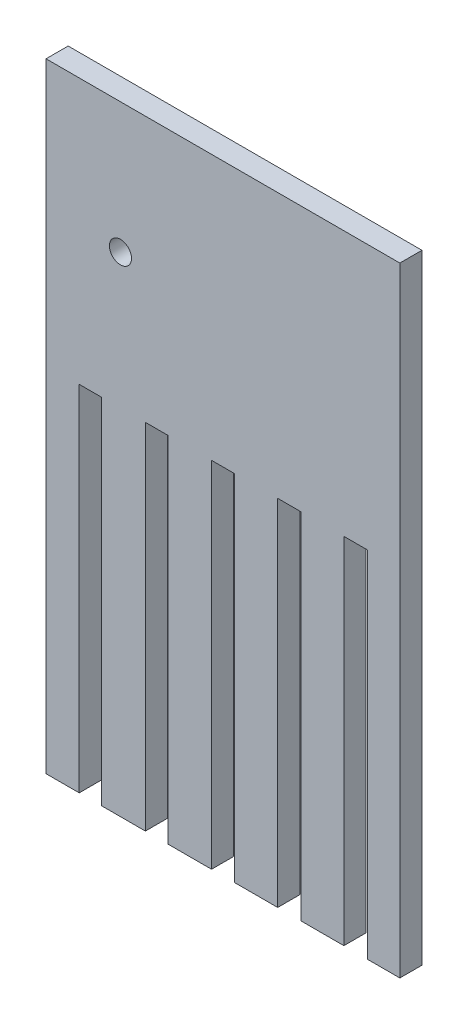
ISO-10303-21;
HEADER;
FILE_DESCRIPTION(('STEP AP214'),'2;1');
FILE_NAME('part.step','',(''),(''),'','','');
FILE_SCHEMA(('AUTOMOTIVE_DESIGN { 1 0 10303 214 1 1 1 1 }'));
ENDSEC;
DATA;
#1=APPLICATION_CONTEXT('core data for automotive mechanical design processes');
#2=APPLICATION_PROTOCOL_DEFINITION('international standard','automotive_design',2000,#1);
#3=PRODUCT_CONTEXT('',#1,'mechanical');
#4=PRODUCT('Part','Part','',(#3));
#5=PRODUCT_RELATED_PRODUCT_CATEGORY('part','',(#4));
#6=PRODUCT_DEFINITION_FORMATION('','',#4);
#7=PRODUCT_DEFINITION_CONTEXT('part definition',#1,'design');
#8=PRODUCT_DEFINITION('design','',#6,#7);
#9=PRODUCT_DEFINITION_SHAPE('','',#8);
#10=(LENGTH_UNIT() NAMED_UNIT(*) SI_UNIT(.MILLI.,.METRE.));
#11=(NAMED_UNIT(*) PLANE_ANGLE_UNIT() SI_UNIT($,.RADIAN.));
#12=(NAMED_UNIT(*) SI_UNIT($,.STERADIAN.) SOLID_ANGLE_UNIT());
#13=UNCERTAINTY_MEASURE_WITH_UNIT(LENGTH_MEASURE(1.E-05),#10,'distance_accuracy_value','');
#14=(GEOMETRIC_REPRESENTATION_CONTEXT(3) GLOBAL_UNCERTAINTY_ASSIGNED_CONTEXT((#13)) GLOBAL_UNIT_ASSIGNED_CONTEXT((#10,
#11,#12)) REPRESENTATION_CONTEXT('',''));
#15=CARTESIAN_POINT('',(0.,0.,0.));
#16=DIRECTION('',(0.,0.,1.));
#17=DIRECTION('',(1.,0.,0.));
#18=AXIS2_PLACEMENT_3D('',#15,#16,#17);
#19=CARTESIAN_POINT('',(0.,-44.45,3.175));
#20=DIRECTION('',(0.,1.,0.));
#21=DIRECTION('',(-1.,0.,0.));
#22=AXIS2_PLACEMENT_3D('',#19,#20,#21);
#23=PLANE('',#22);
#24=DIRECTION('',(0.,0.,1.));
#25=VECTOR('',#24,1.);
#26=CARTESIAN_POINT('',(11.1887,-44.45,0.));
#27=LINE('',#26,#25);
#28=CARTESIAN_POINT('',(11.1887,-44.45,0.));
#29=VERTEX_POINT('',#28);
#30=CARTESIAN_POINT('',(11.1887,-44.45,3.175));
#31=VERTEX_POINT('',#30);
#32=EDGE_CURVE('E256',#29,#31,#27,.T.);
#33=ORIENTED_EDGE('',*,*,#32,.F.);
#34=DIRECTION('',(1.,0.,0.));
#35=VECTOR('',#34,1.);
#36=CARTESIAN_POINT('',(0.,-44.45,0.));
#37=LINE('',#36,#35);
#38=CARTESIAN_POINT('',(17.3609,-44.45,0.));
#39=VERTEX_POINT('',#38);
#40=EDGE_CURVE('E419',#29,#39,#37,.T.);
#41=ORIENTED_EDGE('',*,*,#40,.T.);
#42=DIRECTION('',(0.,0.,1.));
#43=VECTOR('',#42,1.);
#44=CARTESIAN_POINT('',(17.3609,-44.45,0.));
#45=LINE('',#44,#43);
#46=CARTESIAN_POINT('',(17.3609,-44.45,3.175));
#47=VERTEX_POINT('',#46);
#48=EDGE_CURVE('E310',#39,#47,#45,.T.);
#49=ORIENTED_EDGE('',*,*,#48,.T.);
#50=DIRECTION('',(1.,0.,0.));
#51=VECTOR('',#50,1.);
#52=CARTESIAN_POINT('',(0.,-44.45,3.175));
#53=LINE('',#52,#51);
#54=EDGE_CURVE('E398',#31,#47,#53,.T.);
#55=ORIENTED_EDGE('',*,*,#54,.F.);
#56=EDGE_LOOP('',(#33,#41,#49,#55));
#57=FACE_BOUND('',#56,.T.);
#58=ADVANCED_FACE('F45',(#57),#23,.F.);
#59=DIRECTION('',(0.,0.,1.));
#60=VECTOR('',#59,1.);
#61=CARTESIAN_POINT('',(20.7391,-44.45,0.));
#62=LINE('',#61,#60);
#63=CARTESIAN_POINT('',(20.7391,-44.45,0.));
#64=VERTEX_POINT('',#63);
#65=CARTESIAN_POINT('',(20.7391,-44.45,3.175));
#66=VERTEX_POINT('',#65);
#67=EDGE_CURVE('E280',#64,#66,#62,.T.);
#68=ORIENTED_EDGE('',*,*,#67,.F.);
#69=CARTESIAN_POINT('',(25.4,-44.45,0.));
#70=VERTEX_POINT('',#69);
#71=EDGE_CURVE('E363',#64,#70,#37,.T.);
#72=ORIENTED_EDGE('',*,*,#71,.T.);
#73=DIRECTION('',(0.,0.,-1.));
#74=VECTOR('',#73,1.);
#75=CARTESIAN_POINT('',(25.4,-44.45,3.175));
#76=LINE('',#75,#74);
#77=CARTESIAN_POINT('',(25.4,-44.45,3.175));
#78=VERTEX_POINT('',#77);
#79=EDGE_CURVE('E53',#78,#70,#76,.T.);
#80=ORIENTED_EDGE('',*,*,#79,.F.);
#81=EDGE_CURVE('E345',#66,#78,#53,.T.);
#82=ORIENTED_EDGE('',*,*,#81,.F.);
#83=EDGE_LOOP('',(#68,#72,#80,#82));
#84=FACE_BOUND('',#83,.T.);
#85=ADVANCED_FACE('F453',(#84),#23,.F.);
#86=DIRECTION('',(0.,0.,1.));
#87=VECTOR('',#86,1.);
#88=CARTESIAN_POINT('',(-11.1379,-44.45,0.));
#89=LINE('',#88,#87);
#90=CARTESIAN_POINT('',(-11.1379,-44.45,0.));
#91=VERTEX_POINT('',#90);
#92=CARTESIAN_POINT('',(-11.1379,-44.45,3.175));
#93=VERTEX_POINT('',#92);
#94=EDGE_CURVE('E240',#91,#93,#89,.T.);
#95=ORIENTED_EDGE('',*,*,#94,.T.);
#96=CARTESIAN_POINT('',(-17.4625,-44.45,3.175));
#97=VERTEX_POINT('',#96);
#98=EDGE_CURVE('E351',#97,#93,#53,.T.);
#99=ORIENTED_EDGE('',*,*,#98,.F.);
#100=DIRECTION('',(0.,0.,1.));
#101=VECTOR('',#100,1.);
#102=CARTESIAN_POINT('',(-17.4625,-44.45,0.));
#103=LINE('',#102,#101);
#104=CARTESIAN_POINT('',(-17.4625,-44.45,0.));
#105=VERTEX_POINT('',#104);
#106=EDGE_CURVE('E336',#105,#97,#103,.T.);
#107=ORIENTED_EDGE('',*,*,#106,.F.);
#108=EDGE_CURVE('E368',#105,#91,#37,.T.);
#109=ORIENTED_EDGE('',*,*,#108,.T.);
#110=EDGE_LOOP('',(#95,#99,#107,#109));
#111=FACE_BOUND('',#110,.T.);
#112=ADVANCED_FACE('F413',(#111),#23,.F.);
#113=DIRECTION('',(0.,0.,1.));
#114=VECTOR('',#113,1.);
#115=CARTESIAN_POINT('',(-7.91209999999998,-44.45,0.));
#116=LINE('',#115,#114);
#117=CARTESIAN_POINT('',(-7.91209999999998,-44.45,0.));
#118=VERTEX_POINT('',#117);
#119=CARTESIAN_POINT('',(-7.91209999999998,-44.45,3.175));
#120=VERTEX_POINT('',#119);
#121=EDGE_CURVE('E237',#118,#120,#116,.T.);
#122=ORIENTED_EDGE('',*,*,#121,.F.);
#123=CARTESIAN_POINT('',(-1.63829999999997,-44.45,0.));
#124=VERTEX_POINT('',#123);
#125=EDGE_CURVE('E226',#118,#124,#37,.T.);
#126=ORIENTED_EDGE('',*,*,#125,.T.);
#127=DIRECTION('',(0.,0.,1.));
#128=VECTOR('',#127,1.);
#129=CARTESIAN_POINT('',(-1.63829999999997,-44.45,0.));
#130=LINE('',#129,#128);
#131=CARTESIAN_POINT('',(-1.63829999999997,-44.45,3.175));
#132=VERTEX_POINT('',#131);
#133=EDGE_CURVE('E262',#124,#132,#130,.T.);
#134=ORIENTED_EDGE('',*,*,#133,.T.);
#135=EDGE_CURVE('E403',#120,#132,#53,.T.);
#136=ORIENTED_EDGE('',*,*,#135,.F.);
#137=EDGE_LOOP('',(#122,#126,#134,#136));
#138=FACE_BOUND('',#137,.T.);
#139=ADVANCED_FACE('F459',(#138),#23,.F.);
#140=DIRECTION('',(0.,0.,1.));
#141=VECTOR('',#140,1.);
#142=CARTESIAN_POINT('',(1.63830000000002,-44.45,0.));
#143=LINE('',#142,#141);
#144=CARTESIAN_POINT('',(1.63830000000002,-44.45,0.));
#145=VERTEX_POINT('',#144);
#146=CARTESIAN_POINT('',(1.63830000000002,-44.45,3.175));
#147=VERTEX_POINT('',#146);
#148=EDGE_CURVE('E235',#145,#147,#143,.T.);
#149=ORIENTED_EDGE('',*,*,#148,.F.);
#150=CARTESIAN_POINT('',(7.86130000000003,-44.45,0.));
#151=VERTEX_POINT('',#150);
#152=EDGE_CURVE('E418',#145,#151,#37,.T.);
#153=ORIENTED_EDGE('',*,*,#152,.T.);
#154=DIRECTION('',(0.,0.,1.));
#155=VECTOR('',#154,1.);
#156=CARTESIAN_POINT('',(7.86130000000003,-44.45,0.));
#157=LINE('',#156,#155);
#158=CARTESIAN_POINT('',(7.86130000000003,-44.45,3.175));
#159=VERTEX_POINT('',#158);
#160=EDGE_CURVE('E286',#151,#159,#157,.T.);
#161=ORIENTED_EDGE('',*,*,#160,.T.);
#162=EDGE_CURVE('E400',#147,#159,#53,.T.);
#163=ORIENTED_EDGE('',*,*,#162,.F.);
#164=EDGE_LOOP('',(#149,#153,#161,#163));
#165=FACE_BOUND('',#164,.T.);
#166=ADVANCED_FACE('F428',(#165),#23,.F.);
#167=CARTESIAN_POINT('',(0.,0.,3.175));
#168=DIRECTION('',(0.,0.,1.));
#169=DIRECTION('',(1.,0.,0.));
#170=AXIS2_PLACEMENT_3D('',#167,#168,#169);
#171=PLANE('',#170);
#172=CARTESIAN_POINT('',(-14.7157897255619,25.7526320197333,3.175));
#173=DIRECTION('',(0.,0.,1.));
#174=DIRECTION('',(1.,0.,0.));
#175=AXIS2_PLACEMENT_3D('',#172,#173,#174);
#176=CIRCLE('',#175,1.5875);
#177=CARTESIAN_POINT('',(-13.1282897255619,25.7526320197333,3.175));
#178=VERTEX_POINT('',#177);
#179=EDGE_CURVE('E357',#178,#178,#176,.T.);
#180=ORIENTED_EDGE('',*,*,#179,.F.);
#181=EDGE_LOOP('',(#180));
#182=FACE_BOUND('',#181,.T.);
#183=DIRECTION('',(1.,0.,0.));
#184=VECTOR('',#183,1.);
#185=CARTESIAN_POINT('',(0.,6.3754,3.175));
#186=LINE('',#185,#184);
#187=CARTESIAN_POINT('',(-11.1379,6.3754,3.175));
#188=VERTEX_POINT('',#187);
#189=CARTESIAN_POINT('',(-7.91209999999998,6.3754,3.175));
#190=VERTEX_POINT('',#189);
#191=EDGE_CURVE('E230',#188,#190,#186,.T.);
#192=ORIENTED_EDGE('',*,*,#191,.T.);
#193=DIRECTION('',(0.,-1.,0.));
#194=VECTOR('',#193,1.);
#195=CARTESIAN_POINT('',(-7.91209999999998,0.,3.175));
#196=LINE('',#195,#194);
#197=EDGE_CURVE('E219',#190,#120,#196,.T.);
#198=ORIENTED_EDGE('',*,*,#197,.T.);
#199=ORIENTED_EDGE('',*,*,#135,.T.);
#200=DIRECTION('',(0.,1.,0.));
#201=VECTOR('',#200,1.);
#202=CARTESIAN_POINT('',(-1.63829999999997,0.,3.175));
#203=LINE('',#202,#201);
#204=CARTESIAN_POINT('',(-1.63829999999997,6.4008,3.175));
#205=VERTEX_POINT('',#204);
#206=EDGE_CURVE('E247',#132,#205,#203,.T.);
#207=ORIENTED_EDGE('',*,*,#206,.T.);
#208=DIRECTION('',(1.,0.,0.));
#209=VECTOR('',#208,1.);
#210=CARTESIAN_POINT('',(0.,6.4008,3.175));
#211=LINE('',#210,#209);
#212=CARTESIAN_POINT('',(1.63830000000002,6.4008,3.175));
#213=VERTEX_POINT('',#212);
#214=EDGE_CURVE('E255',#205,#213,#211,.T.);
#215=ORIENTED_EDGE('',*,*,#214,.T.);
#216=DIRECTION('',(0.,-1.,0.));
#217=VECTOR('',#216,1.);
#218=CARTESIAN_POINT('',(1.63830000000002,0.,3.175));
#219=LINE('',#218,#217);
#220=EDGE_CURVE('E252',#213,#147,#219,.T.);
#221=ORIENTED_EDGE('',*,*,#220,.T.);
#222=ORIENTED_EDGE('',*,*,#162,.T.);
#223=DIRECTION('',(0.,1.,0.));
#224=VECTOR('',#223,1.);
#225=CARTESIAN_POINT('',(7.86130000000003,0.,3.175));
#226=LINE('',#225,#224);
#227=CARTESIAN_POINT('',(7.86130000000003,6.4262,3.175));
#228=VERTEX_POINT('',#227);
#229=EDGE_CURVE('E270',#159,#228,#226,.T.);
#230=ORIENTED_EDGE('',*,*,#229,.T.);
#231=DIRECTION('',(1.,0.,0.));
#232=VECTOR('',#231,1.);
#233=CARTESIAN_POINT('',(0.,6.4262,3.175));
#234=LINE('',#233,#232);
#235=CARTESIAN_POINT('',(11.1887,6.4262,3.175));
#236=VERTEX_POINT('',#235);
#237=EDGE_CURVE('E279',#228,#236,#234,.T.);
#238=ORIENTED_EDGE('',*,*,#237,.T.);
#239=DIRECTION('',(0.,-1.,0.));
#240=VECTOR('',#239,1.);
#241=CARTESIAN_POINT('',(11.1887,0.,3.175));
#242=LINE('',#241,#240);
#243=EDGE_CURVE('E276',#236,#31,#242,.T.);
#244=ORIENTED_EDGE('',*,*,#243,.T.);
#245=ORIENTED_EDGE('',*,*,#54,.T.);
#246=DIRECTION('',(0.,1.,0.));
#247=VECTOR('',#246,1.);
#248=CARTESIAN_POINT('',(17.3609,0.,3.175));
#249=LINE('',#248,#247);
#250=CARTESIAN_POINT('',(17.3609,6.4516,3.175));
#251=VERTEX_POINT('',#250);
#252=EDGE_CURVE('E295',#47,#251,#249,.T.);
#253=ORIENTED_EDGE('',*,*,#252,.T.);
#254=DIRECTION('',(1.,0.,0.));
#255=VECTOR('',#254,1.);
#256=CARTESIAN_POINT('',(0.,6.4516,3.175));
#257=LINE('',#256,#255);
#258=CARTESIAN_POINT('',(20.7391,6.4516,3.175));
#259=VERTEX_POINT('',#258);
#260=EDGE_CURVE('E304',#251,#259,#257,.T.);
#261=ORIENTED_EDGE('',*,*,#260,.T.);
#262=DIRECTION('',(0.,-1.,0.));
#263=VECTOR('',#262,1.);
#264=CARTESIAN_POINT('',(20.7391,0.,3.175));
#265=LINE('',#264,#263);
#266=EDGE_CURVE('E301',#259,#66,#265,.T.);
#267=ORIENTED_EDGE('',*,*,#266,.T.);
#268=ORIENTED_EDGE('',*,*,#81,.T.);
#269=DIRECTION('',(0.,-1.,0.));
#270=VECTOR('',#269,1.);
#271=CARTESIAN_POINT('',(25.4,0.,3.175));
#272=LINE('',#271,#270);
#273=CARTESIAN_POINT('',(25.4,44.45,3.175));
#274=VERTEX_POINT('',#273);
#275=EDGE_CURVE('E350',#274,#78,#272,.T.);
#276=ORIENTED_EDGE('',*,*,#275,.F.);
#277=DIRECTION('',(1.,0.,0.));
#278=VECTOR('',#277,1.);
#279=CARTESIAN_POINT('',(0.,44.45,3.175));
#280=LINE('',#279,#278);
#281=CARTESIAN_POINT('',(-25.4,44.45,3.175));
#282=VERTEX_POINT('',#281);
#283=EDGE_CURVE('E354',#282,#274,#280,.T.);
#284=ORIENTED_EDGE('',*,*,#283,.F.);
#285=DIRECTION('',(0.,-1.,0.));
#286=VECTOR('',#285,1.);
#287=CARTESIAN_POINT('',(-25.4,0.,3.175));
#288=LINE('',#287,#286);
#289=CARTESIAN_POINT('',(-25.4,-44.45,3.175));
#290=VERTEX_POINT('',#289);
#291=EDGE_CURVE('E342',#282,#290,#288,.T.);
#292=ORIENTED_EDGE('',*,*,#291,.T.);
#293=CARTESIAN_POINT('',(-20.6375,-44.45,3.175));
#294=VERTEX_POINT('',#293);
#295=EDGE_CURVE('E347',#290,#294,#53,.T.);
#296=ORIENTED_EDGE('',*,*,#295,.T.);
#297=DIRECTION('',(0.,-1.,0.));
#298=VECTOR('',#297,1.);
#299=CARTESIAN_POINT('',(-20.6375,0.,3.175));
#300=LINE('',#299,#298);
#301=CARTESIAN_POINT('',(-20.6375,6.35,3.175));
#302=VERTEX_POINT('',#301);
#303=EDGE_CURVE('E329',#302,#294,#300,.T.);
#304=ORIENTED_EDGE('',*,*,#303,.F.);
#305=DIRECTION('',(-1.,0.,0.));
#306=VECTOR('',#305,1.);
#307=CARTESIAN_POINT('',(-19.05,6.35,3.175));
#308=LINE('',#307,#306);
#309=CARTESIAN_POINT('',(-17.4625,6.35,3.175));
#310=VERTEX_POINT('',#309);
#311=EDGE_CURVE('E239',#310,#302,#308,.T.);
#312=ORIENTED_EDGE('',*,*,#311,.F.);
#313=DIRECTION('',(0.,1.,0.));
#314=VECTOR('',#313,1.);
#315=CARTESIAN_POINT('',(-17.4625,0.,3.175));
#316=LINE('',#315,#314);
#317=EDGE_CURVE('E320',#97,#310,#316,.T.);
#318=ORIENTED_EDGE('',*,*,#317,.F.);
#319=ORIENTED_EDGE('',*,*,#98,.T.);
#320=DIRECTION('',(0.,1.,0.));
#321=VECTOR('',#320,1.);
#322=CARTESIAN_POINT('',(-11.1379,0.,3.175));
#323=LINE('',#322,#321);
#324=EDGE_CURVE('E227',#93,#188,#323,.T.);
#325=ORIENTED_EDGE('',*,*,#324,.T.);
#326=EDGE_LOOP('',(#192,#198,#199,#207,#215,#221,#222,#230,#238,#244,#245,#253,#261,#267,#268,
#276,#284,#292,#296,#304,#312,#318,#319,#325));
#327=FACE_BOUND('',#326,.T.);
#328=ADVANCED_FACE('F395',(#182,#327),#171,.T.);
#329=CARTESIAN_POINT('',(0.,0.,0.));
#330=DIRECTION('',(0.,0.,1.));
#331=DIRECTION('',(1.,0.,0.));
#332=AXIS2_PLACEMENT_3D('',#329,#330,#331);
#333=PLANE('',#332);
#334=CARTESIAN_POINT('',(-14.7157897255619,25.7526320197333,0.));
#335=DIRECTION('',(0.,0.,1.));
#336=DIRECTION('',(1.,0.,0.));
#337=AXIS2_PLACEMENT_3D('',#334,#335,#336);
#338=CIRCLE('',#337,1.5875);
#339=CARTESIAN_POINT('',(-13.1282897255619,25.7526320197333,0.));
#340=VERTEX_POINT('',#339);
#341=EDGE_CURVE('E346',#340,#340,#338,.T.);
#342=ORIENTED_EDGE('',*,*,#341,.T.);
#343=EDGE_LOOP('',(#342));
#344=FACE_BOUND('',#343,.T.);
#345=DIRECTION('',(0.,-1.,0.));
#346=VECTOR('',#345,1.);
#347=CARTESIAN_POINT('',(-7.91209999999998,0.,0.));
#348=LINE('',#347,#346);
#349=CARTESIAN_POINT('',(-7.91209999999998,6.3754,0.));
#350=VERTEX_POINT('',#349);
#351=EDGE_CURVE('E213',#350,#118,#348,.T.);
#352=ORIENTED_EDGE('',*,*,#351,.F.);
#353=DIRECTION('',(1.,0.,0.));
#354=VECTOR('',#353,1.);
#355=CARTESIAN_POINT('',(0.,6.3754,0.));
#356=LINE('',#355,#354);
#357=CARTESIAN_POINT('',(-11.1379,6.3754,0.));
#358=VERTEX_POINT('',#357);
#359=EDGE_CURVE('E204',#358,#350,#356,.T.);
#360=ORIENTED_EDGE('',*,*,#359,.F.);
#361=DIRECTION('',(0.,1.,0.));
#362=VECTOR('',#361,1.);
#363=CARTESIAN_POINT('',(-11.1379,0.,0.));
#364=LINE('',#363,#362);
#365=EDGE_CURVE('E212',#91,#358,#364,.T.);
#366=ORIENTED_EDGE('',*,*,#365,.F.);
#367=ORIENTED_EDGE('',*,*,#108,.F.);
#368=DIRECTION('',(0.,1.,0.));
#369=VECTOR('',#368,1.);
#370=CARTESIAN_POINT('',(-17.4625,0.,0.));
#371=LINE('',#370,#369);
#372=CARTESIAN_POINT('',(-17.4625,6.35,0.));
#373=VERTEX_POINT('',#372);
#374=EDGE_CURVE('E323',#105,#373,#371,.T.);
#375=ORIENTED_EDGE('',*,*,#374,.T.);
#376=DIRECTION('',(-1.,0.,0.));
#377=VECTOR('',#376,1.);
#378=CARTESIAN_POINT('',(-19.05,6.35,0.));
#379=LINE('',#378,#377);
#380=CARTESIAN_POINT('',(-20.6375,6.35,0.));
#381=VERTEX_POINT('',#380);
#382=EDGE_CURVE('E316',#373,#381,#379,.T.);
#383=ORIENTED_EDGE('',*,*,#382,.T.);
#384=DIRECTION('',(0.,-1.,0.));
#385=VECTOR('',#384,1.);
#386=CARTESIAN_POINT('',(-20.6375,0.,0.));
#387=LINE('',#386,#385);
#388=CARTESIAN_POINT('',(-20.6375,-44.45,0.));
#389=VERTEX_POINT('',#388);
#390=EDGE_CURVE('E319',#381,#389,#387,.T.);
#391=ORIENTED_EDGE('',*,*,#390,.T.);
#392=CARTESIAN_POINT('',(-25.4,-44.45,0.));
#393=VERTEX_POINT('',#392);
#394=EDGE_CURVE('E364',#393,#389,#37,.T.);
#395=ORIENTED_EDGE('',*,*,#394,.F.);
#396=DIRECTION('',(0.,-1.,0.));
#397=VECTOR('',#396,1.);
#398=CARTESIAN_POINT('',(-25.4,0.,0.));
#399=LINE('',#398,#397);
#400=CARTESIAN_POINT('',(-25.4,44.45,0.));
#401=VERTEX_POINT('',#400);
#402=EDGE_CURVE('E335',#401,#393,#399,.T.);
#403=ORIENTED_EDGE('',*,*,#402,.F.);
#404=DIRECTION('',(1.,0.,0.));
#405=VECTOR('',#404,1.);
#406=CARTESIAN_POINT('',(0.,44.45,0.));
#407=LINE('',#406,#405);
#408=CARTESIAN_POINT('',(25.4,44.45,0.));
#409=VERTEX_POINT('',#408);
#410=EDGE_CURVE('E371',#401,#409,#407,.T.);
#411=ORIENTED_EDGE('',*,*,#410,.T.);
#412=DIRECTION('',(0.,-1.,0.));
#413=VECTOR('',#412,1.);
#414=CARTESIAN_POINT('',(25.4,0.,0.));
#415=LINE('',#414,#413);
#416=EDGE_CURVE('E367',#409,#70,#415,.T.);
#417=ORIENTED_EDGE('',*,*,#416,.T.);
#418=ORIENTED_EDGE('',*,*,#71,.F.);
#419=DIRECTION('',(0.,-1.,0.));
#420=VECTOR('',#419,1.);
#421=CARTESIAN_POINT('',(20.7391,0.,0.));
#422=LINE('',#421,#420);
#423=CARTESIAN_POINT('',(20.7391,6.4516,0.));
#424=VERTEX_POINT('',#423);
#425=EDGE_CURVE('E292',#424,#64,#422,.T.);
#426=ORIENTED_EDGE('',*,*,#425,.F.);
#427=DIRECTION('',(1.,0.,0.));
#428=VECTOR('',#427,1.);
#429=CARTESIAN_POINT('',(0.,6.4516,0.));
#430=LINE('',#429,#428);
#431=CARTESIAN_POINT('',(17.3609,6.4516,0.));
#432=VERTEX_POINT('',#431);
#433=EDGE_CURVE('E294',#432,#424,#430,.T.);
#434=ORIENTED_EDGE('',*,*,#433,.F.);
#435=DIRECTION('',(0.,1.,0.));
#436=VECTOR('',#435,1.);
#437=CARTESIAN_POINT('',(17.3609,0.,0.));
#438=LINE('',#437,#436);
#439=EDGE_CURVE('E297',#39,#432,#438,.T.);
#440=ORIENTED_EDGE('',*,*,#439,.F.);
#441=ORIENTED_EDGE('',*,*,#40,.F.);
#442=DIRECTION('',(0.,-1.,0.));
#443=VECTOR('',#442,1.);
#444=CARTESIAN_POINT('',(11.1887,0.,0.));
#445=LINE('',#444,#443);
#446=CARTESIAN_POINT('',(11.1887,6.4262,0.));
#447=VERTEX_POINT('',#446);
#448=EDGE_CURVE('E267',#447,#29,#445,.T.);
#449=ORIENTED_EDGE('',*,*,#448,.F.);
#450=DIRECTION('',(1.,0.,0.));
#451=VECTOR('',#450,1.);
#452=CARTESIAN_POINT('',(0.,6.4262,0.));
#453=LINE('',#452,#451);
#454=CARTESIAN_POINT('',(7.86130000000003,6.4262,0.));
#455=VERTEX_POINT('',#454);
#456=EDGE_CURVE('E269',#455,#447,#453,.T.);
#457=ORIENTED_EDGE('',*,*,#456,.F.);
#458=DIRECTION('',(0.,1.,0.));
#459=VECTOR('',#458,1.);
#460=CARTESIAN_POINT('',(7.86130000000003,0.,0.));
#461=LINE('',#460,#459);
#462=EDGE_CURVE('E272',#151,#455,#461,.T.);
#463=ORIENTED_EDGE('',*,*,#462,.F.);
#464=ORIENTED_EDGE('',*,*,#152,.F.);
#465=DIRECTION('',(0.,-1.,0.));
#466=VECTOR('',#465,1.);
#467=CARTESIAN_POINT('',(1.63830000000002,0.,0.));
#468=LINE('',#467,#466);
#469=CARTESIAN_POINT('',(1.63830000000002,6.4008,0.));
#470=VERTEX_POINT('',#469);
#471=EDGE_CURVE('E244',#470,#145,#468,.T.);
#472=ORIENTED_EDGE('',*,*,#471,.F.);
#473=DIRECTION('',(1.,0.,0.));
#474=VECTOR('',#473,1.);
#475=CARTESIAN_POINT('',(0.,6.4008,0.));
#476=LINE('',#475,#474);
#477=CARTESIAN_POINT('',(-1.63829999999997,6.4008,0.));
#478=VERTEX_POINT('',#477);
#479=EDGE_CURVE('E246',#478,#470,#476,.T.);
#480=ORIENTED_EDGE('',*,*,#479,.F.);
#481=DIRECTION('',(0.,1.,0.));
#482=VECTOR('',#481,1.);
#483=CARTESIAN_POINT('',(-1.63829999999997,0.,0.));
#484=LINE('',#483,#482);
#485=EDGE_CURVE('E249',#124,#478,#484,.T.);
#486=ORIENTED_EDGE('',*,*,#485,.F.);
#487=ORIENTED_EDGE('',*,*,#125,.F.);
#488=EDGE_LOOP('',(#352,#360,#366,#367,#375,#383,#391,#395,#403,#411,#417,#418,#426,#434,#440,
#441,#449,#457,#463,#464,#472,#480,#486,#487));
#489=FACE_BOUND('',#488,.T.);
#490=ADVANCED_FACE('F223',(#344,#489),#333,.F.);
#491=CARTESIAN_POINT('',(-25.4,0.,3.175));
#492=DIRECTION('',(1.,0.,0.));
#493=DIRECTION('',(0.,1.,0.));
#494=AXIS2_PLACEMENT_3D('',#491,#492,#493);
#495=PLANE('',#494);
#496=ORIENTED_EDGE('',*,*,#402,.T.);
#497=DIRECTION('',(0.,0.,-1.));
#498=VECTOR('',#497,1.);
#499=CARTESIAN_POINT('',(-25.4,-44.45,3.175));
#500=LINE('',#499,#498);
#501=EDGE_CURVE('E11',#290,#393,#500,.T.);
#502=ORIENTED_EDGE('',*,*,#501,.F.);
#503=ORIENTED_EDGE('',*,*,#291,.F.);
#504=DIRECTION('',(0.,0.,-1.));
#505=VECTOR('',#504,1.);
#506=CARTESIAN_POINT('',(-25.4,44.45,3.175));
#507=LINE('',#506,#505);
#508=EDGE_CURVE('E360',#282,#401,#507,.T.);
#509=ORIENTED_EDGE('',*,*,#508,.T.);
#510=EDGE_LOOP('',(#496,#502,#503,#509));
#511=FACE_BOUND('',#510,.T.);
#512=ADVANCED_FACE('F47',(#511),#495,.F.);
#513=ORIENTED_EDGE('',*,*,#394,.T.);
#514=DIRECTION('',(0.,0.,1.));
#515=VECTOR('',#514,1.);
#516=CARTESIAN_POINT('',(-20.6375,-44.45,0.));
#517=LINE('',#516,#515);
#518=EDGE_CURVE('E338',#389,#294,#517,.T.);
#519=ORIENTED_EDGE('',*,*,#518,.T.);
#520=ORIENTED_EDGE('',*,*,#295,.F.);
#521=ORIENTED_EDGE('',*,*,#501,.T.);
#522=EDGE_LOOP('',(#513,#519,#520,#521));
#523=FACE_BOUND('',#522,.T.);
#524=ADVANCED_FACE('F460',(#523),#23,.F.);
#525=CARTESIAN_POINT('',(25.4,0.,3.175));
#526=DIRECTION('',(1.,0.,0.));
#527=DIRECTION('',(0.,1.,0.));
#528=AXIS2_PLACEMENT_3D('',#525,#526,#527);
#529=PLANE('',#528);
#530=ORIENTED_EDGE('',*,*,#416,.F.);
#531=DIRECTION('',(0.,0.,-1.));
#532=VECTOR('',#531,1.);
#533=CARTESIAN_POINT('',(25.4,44.45,3.175));
#534=LINE('',#533,#532);
#535=EDGE_CURVE('E377',#274,#409,#534,.T.);
#536=ORIENTED_EDGE('',*,*,#535,.F.);
#537=ORIENTED_EDGE('',*,*,#275,.T.);
#538=ORIENTED_EDGE('',*,*,#79,.T.);
#539=EDGE_LOOP('',(#530,#536,#537,#538));
#540=FACE_BOUND('',#539,.T.);
#541=ADVANCED_FACE('F382',(#540),#529,.T.);
#542=CARTESIAN_POINT('',(0.,44.45,3.175));
#543=DIRECTION('',(0.,1.,0.));
#544=DIRECTION('',(-1.,0.,0.));
#545=AXIS2_PLACEMENT_3D('',#542,#543,#544);
#546=PLANE('',#545);
#547=ORIENTED_EDGE('',*,*,#410,.F.);
#548=ORIENTED_EDGE('',*,*,#508,.F.);
#549=ORIENTED_EDGE('',*,*,#283,.T.);
#550=ORIENTED_EDGE('',*,*,#535,.T.);
#551=EDGE_LOOP('',(#547,#548,#549,#550));
#552=FACE_BOUND('',#551,.T.);
#553=ADVANCED_FACE('F391',(#552),#546,.T.);
#554=CARTESIAN_POINT('',(-14.7157897255619,25.7526320197333,3.175));
#555=DIRECTION('',(0.,0.,-1.));
#556=DIRECTION('',(-1.,0.,0.));
#557=AXIS2_PLACEMENT_3D('',#554,#555,#556);
#558=CYLINDRICAL_SURFACE('',#557,1.5875);
#559=ORIENTED_EDGE('',*,*,#179,.T.);
#560=EDGE_LOOP('',(#559));
#561=FACE_BOUND('',#560,.T.);
#562=ORIENTED_EDGE('',*,*,#341,.F.);
#563=EDGE_LOOP('',(#562));
#564=FACE_BOUND('',#563,.T.);
#565=ADVANCED_FACE('F468',(#561,#564),#558,.F.);
#566=CARTESIAN_POINT('',(-19.05,6.35,0.));
#567=DIRECTION('',(0.,1.,0.));
#568=DIRECTION('',(0.,0.,1.));
#569=AXIS2_PLACEMENT_3D('',#566,#567,#568);
#570=PLANE('',#569);
#571=ORIENTED_EDGE('',*,*,#311,.T.);
#572=DIRECTION('',(0.,0.,1.));
#573=VECTOR('',#572,1.);
#574=CARTESIAN_POINT('',(-20.6375,6.35,0.));
#575=LINE('',#574,#573);
#576=EDGE_CURVE('E326',#381,#302,#575,.T.);
#577=ORIENTED_EDGE('',*,*,#576,.F.);
#578=ORIENTED_EDGE('',*,*,#382,.F.);
#579=DIRECTION('',(0.,0.,1.));
#580=VECTOR('',#579,1.);
#581=CARTESIAN_POINT('',(-17.4625,6.35,0.));
#582=LINE('',#581,#580);
#583=EDGE_CURVE('E333',#373,#310,#582,.T.);
#584=ORIENTED_EDGE('',*,*,#583,.T.);
#585=EDGE_LOOP('',(#571,#577,#578,#584));
#586=FACE_BOUND('',#585,.T.);
#587=ADVANCED_FACE('F471',(#586),#570,.F.);
#588=CARTESIAN_POINT('',(-17.4625,0.,0.));
#589=DIRECTION('',(1.,0.,0.));
#590=DIRECTION('',(0.,1.,0.));
#591=AXIS2_PLACEMENT_3D('',#588,#589,#590);
#592=PLANE('',#591);
#593=ORIENTED_EDGE('',*,*,#317,.T.);
#594=ORIENTED_EDGE('',*,*,#583,.F.);
#595=ORIENTED_EDGE('',*,*,#374,.F.);
#596=ORIENTED_EDGE('',*,*,#106,.T.);
#597=EDGE_LOOP('',(#593,#594,#595,#596));
#598=FACE_BOUND('',#597,.T.);
#599=ADVANCED_FACE('F481',(#598),#592,.F.);
#600=CARTESIAN_POINT('',(-20.6375,0.,0.));
#601=DIRECTION('',(-1.,0.,0.));
#602=DIRECTION('',(0.,-1.,0.));
#603=AXIS2_PLACEMENT_3D('',#600,#601,#602);
#604=PLANE('',#603);
#605=ORIENTED_EDGE('',*,*,#303,.T.);
#606=ORIENTED_EDGE('',*,*,#518,.F.);
#607=ORIENTED_EDGE('',*,*,#390,.F.);
#608=ORIENTED_EDGE('',*,*,#576,.T.);
#609=EDGE_LOOP('',(#605,#606,#607,#608));
#610=FACE_BOUND('',#609,.T.);
#611=ADVANCED_FACE('F483',(#610),#604,.F.);
#612=CARTESIAN_POINT('',(20.7391,0.,0.));
#613=DIRECTION('',(-1.,0.,0.));
#614=DIRECTION('',(0.,0.,1.));
#615=AXIS2_PLACEMENT_3D('',#612,#613,#614);
#616=PLANE('',#615);
#617=ORIENTED_EDGE('',*,*,#266,.F.);
#618=DIRECTION('',(0.,0.,1.));
#619=VECTOR('',#618,1.);
#620=CARTESIAN_POINT('',(20.7391,6.4516,0.));
#621=LINE('',#620,#619);
#622=EDGE_CURVE('E300',#424,#259,#621,.T.);
#623=ORIENTED_EDGE('',*,*,#622,.F.);
#624=ORIENTED_EDGE('',*,*,#425,.T.);
#625=ORIENTED_EDGE('',*,*,#67,.T.);
#626=EDGE_LOOP('',(#617,#623,#624,#625));
#627=FACE_BOUND('',#626,.T.);
#628=ADVANCED_FACE('F452',(#627),#616,.T.);
#629=CARTESIAN_POINT('',(17.3609,0.,0.));
#630=DIRECTION('',(1.,0.,0.));
#631=DIRECTION('',(0.,0.,-1.));
#632=AXIS2_PLACEMENT_3D('',#629,#630,#631);
#633=PLANE('',#632);
#634=ORIENTED_EDGE('',*,*,#252,.F.);
#635=ORIENTED_EDGE('',*,*,#48,.F.);
#636=ORIENTED_EDGE('',*,*,#439,.T.);
#637=DIRECTION('',(0.,0.,1.));
#638=VECTOR('',#637,1.);
#639=CARTESIAN_POINT('',(17.3609,6.4516,0.));
#640=LINE('',#639,#638);
#641=EDGE_CURVE('E313',#432,#251,#640,.T.);
#642=ORIENTED_EDGE('',*,*,#641,.T.);
#643=EDGE_LOOP('',(#634,#635,#636,#642));
#644=FACE_BOUND('',#643,.T.);
#645=ADVANCED_FACE('F446',(#644),#633,.T.);
#646=CARTESIAN_POINT('',(0.,6.4516,0.));
#647=DIRECTION('',(0.,-1.,0.));
#648=DIRECTION('',(0.,0.,-1.));
#649=AXIS2_PLACEMENT_3D('',#646,#647,#648);
#650=PLANE('',#649);
#651=ORIENTED_EDGE('',*,*,#260,.F.);
#652=ORIENTED_EDGE('',*,*,#641,.F.);
#653=ORIENTED_EDGE('',*,*,#433,.T.);
#654=ORIENTED_EDGE('',*,*,#622,.T.);
#655=EDGE_LOOP('',(#651,#652,#653,#654));
#656=FACE_BOUND('',#655,.T.);
#657=ADVANCED_FACE('F449',(#656),#650,.T.);
#658=CARTESIAN_POINT('',(11.1887,0.,0.));
#659=DIRECTION('',(-1.,0.,0.));
#660=DIRECTION('',(0.,0.,1.));
#661=AXIS2_PLACEMENT_3D('',#658,#659,#660);
#662=PLANE('',#661);
#663=ORIENTED_EDGE('',*,*,#243,.F.);
#664=DIRECTION('',(0.,0.,1.));
#665=VECTOR('',#664,1.);
#666=CARTESIAN_POINT('',(11.1887,6.4262,0.));
#667=LINE('',#666,#665);
#668=EDGE_CURVE('E275',#447,#236,#667,.T.);
#669=ORIENTED_EDGE('',*,*,#668,.F.);
#670=ORIENTED_EDGE('',*,*,#448,.T.);
#671=ORIENTED_EDGE('',*,*,#32,.T.);
#672=EDGE_LOOP('',(#663,#669,#670,#671));
#673=FACE_BOUND('',#672,.T.);
#674=ADVANCED_FACE('F442',(#673),#662,.T.);
#675=CARTESIAN_POINT('',(7.86130000000003,0.,0.));
#676=DIRECTION('',(1.,0.,0.));
#677=DIRECTION('',(0.,0.,-1.));
#678=AXIS2_PLACEMENT_3D('',#675,#676,#677);
#679=PLANE('',#678);
#680=ORIENTED_EDGE('',*,*,#229,.F.);
#681=ORIENTED_EDGE('',*,*,#160,.F.);
#682=ORIENTED_EDGE('',*,*,#462,.T.);
#683=DIRECTION('',(0.,0.,1.));
#684=VECTOR('',#683,1.);
#685=CARTESIAN_POINT('',(7.86130000000003,6.4262,0.));
#686=LINE('',#685,#684);
#687=EDGE_CURVE('E289',#455,#228,#686,.T.);
#688=ORIENTED_EDGE('',*,*,#687,.T.);
#689=EDGE_LOOP('',(#680,#681,#682,#688));
#690=FACE_BOUND('',#689,.T.);
#691=ADVANCED_FACE('F435',(#690),#679,.T.);
#692=CARTESIAN_POINT('',(0.,6.4262,0.));
#693=DIRECTION('',(0.,-1.,0.));
#694=DIRECTION('',(0.,0.,-1.));
#695=AXIS2_PLACEMENT_3D('',#692,#693,#694);
#696=PLANE('',#695);
#697=ORIENTED_EDGE('',*,*,#237,.F.);
#698=ORIENTED_EDGE('',*,*,#687,.F.);
#699=ORIENTED_EDGE('',*,*,#456,.T.);
#700=ORIENTED_EDGE('',*,*,#668,.T.);
#701=EDGE_LOOP('',(#697,#698,#699,#700));
#702=FACE_BOUND('',#701,.T.);
#703=ADVANCED_FACE('F439',(#702),#696,.T.);
#704=CARTESIAN_POINT('',(1.63830000000002,0.,0.));
#705=DIRECTION('',(-1.,0.,0.));
#706=DIRECTION('',(0.,0.,1.));
#707=AXIS2_PLACEMENT_3D('',#704,#705,#706);
#708=PLANE('',#707);
#709=ORIENTED_EDGE('',*,*,#220,.F.);
#710=DIRECTION('',(0.,0.,1.));
#711=VECTOR('',#710,1.);
#712=CARTESIAN_POINT('',(1.63830000000002,6.4008,0.));
#713=LINE('',#712,#711);
#714=EDGE_CURVE('E251',#470,#213,#713,.T.);
#715=ORIENTED_EDGE('',*,*,#714,.F.);
#716=ORIENTED_EDGE('',*,*,#471,.T.);
#717=ORIENTED_EDGE('',*,*,#148,.T.);
#718=EDGE_LOOP('',(#709,#715,#716,#717));
#719=FACE_BOUND('',#718,.T.);
#720=ADVANCED_FACE('F500',(#719),#708,.T.);
#721=CARTESIAN_POINT('',(-1.63829999999997,0.,0.));
#722=DIRECTION('',(1.,0.,0.));
#723=DIRECTION('',(0.,0.,-1.));
#724=AXIS2_PLACEMENT_3D('',#721,#722,#723);
#725=PLANE('',#724);
#726=ORIENTED_EDGE('',*,*,#206,.F.);
#727=ORIENTED_EDGE('',*,*,#133,.F.);
#728=ORIENTED_EDGE('',*,*,#485,.T.);
#729=DIRECTION('',(0.,0.,1.));
#730=VECTOR('',#729,1.);
#731=CARTESIAN_POINT('',(-1.63829999999997,6.4008,0.));
#732=LINE('',#731,#730);
#733=EDGE_CURVE('E68',#478,#205,#732,.T.);
#734=ORIENTED_EDGE('',*,*,#733,.T.);
#735=EDGE_LOOP('',(#726,#727,#728,#734));
#736=FACE_BOUND('',#735,.T.);
#737=ADVANCED_FACE('F505',(#736),#725,.T.);
#738=CARTESIAN_POINT('',(0.,6.4008,0.));
#739=DIRECTION('',(0.,-1.,0.));
#740=DIRECTION('',(0.,0.,-1.));
#741=AXIS2_PLACEMENT_3D('',#738,#739,#740);
#742=PLANE('',#741);
#743=ORIENTED_EDGE('',*,*,#214,.F.);
#744=ORIENTED_EDGE('',*,*,#733,.F.);
#745=ORIENTED_EDGE('',*,*,#479,.T.);
#746=ORIENTED_EDGE('',*,*,#714,.T.);
#747=EDGE_LOOP('',(#743,#744,#745,#746));
#748=FACE_BOUND('',#747,.T.);
#749=ADVANCED_FACE('F507',(#748),#742,.T.);
#750=CARTESIAN_POINT('',(-7.91209999999998,0.,0.));
#751=DIRECTION('',(-1.,0.,0.));
#752=DIRECTION('',(0.,0.,1.));
#753=AXIS2_PLACEMENT_3D('',#750,#751,#752);
#754=PLANE('',#753);
#755=ORIENTED_EDGE('',*,*,#197,.F.);
#756=DIRECTION('',(0.,0.,1.));
#757=VECTOR('',#756,1.);
#758=CARTESIAN_POINT('',(-7.91209999999998,6.3754,0.));
#759=LINE('',#758,#757);
#760=EDGE_CURVE('E207',#350,#190,#759,.T.);
#761=ORIENTED_EDGE('',*,*,#760,.F.);
#762=ORIENTED_EDGE('',*,*,#351,.T.);
#763=ORIENTED_EDGE('',*,*,#121,.T.);
#764=EDGE_LOOP('',(#755,#761,#762,#763));
#765=FACE_BOUND('',#764,.T.);
#766=ADVANCED_FACE('F216',(#765),#754,.T.);
#767=CARTESIAN_POINT('',(-11.1379,0.,0.));
#768=DIRECTION('',(1.,0.,0.));
#769=DIRECTION('',(0.,0.,-1.));
#770=AXIS2_PLACEMENT_3D('',#767,#768,#769);
#771=PLANE('',#770);
#772=ORIENTED_EDGE('',*,*,#324,.F.);
#773=ORIENTED_EDGE('',*,*,#94,.F.);
#774=ORIENTED_EDGE('',*,*,#365,.T.);
#775=DIRECTION('',(0.,0.,1.));
#776=VECTOR('',#775,1.);
#777=CARTESIAN_POINT('',(-11.1379,6.3754,0.));
#778=LINE('',#777,#776);
#779=EDGE_CURVE('E60',#358,#188,#778,.T.);
#780=ORIENTED_EDGE('',*,*,#779,.T.);
#781=EDGE_LOOP('',(#772,#773,#774,#780));
#782=FACE_BOUND('',#781,.T.);
#783=ADVANCED_FACE('F417',(#782),#771,.T.);
#784=CARTESIAN_POINT('',(0.,6.3754,0.));
#785=DIRECTION('',(0.,-1.,0.));
#786=DIRECTION('',(0.,0.,-1.));
#787=AXIS2_PLACEMENT_3D('',#784,#785,#786);
#788=PLANE('',#787);
#789=ORIENTED_EDGE('',*,*,#191,.F.);
#790=ORIENTED_EDGE('',*,*,#779,.F.);
#791=ORIENTED_EDGE('',*,*,#359,.T.);
#792=ORIENTED_EDGE('',*,*,#760,.T.);
#793=EDGE_LOOP('',(#789,#790,#791,#792));
#794=FACE_BOUND('',#793,.T.);
#795=ADVANCED_FACE('F206',(#794),#788,.T.);
#796=CLOSED_SHELL('',(#58,#85,#112,#139,#166,#328,#490,#512,#524,#541,#553,#565,#587,#599,#611,
#628,#645,#657,#674,#691,#703,#720,#737,#749,#766,#783,#795));
#797=MANIFOLD_SOLID_BREP('B2',#796);
#798=ADVANCED_BREP_SHAPE_REPRESENTATION('',(#18,#797),#14);
#799=SHAPE_DEFINITION_REPRESENTATION(#9,#798);
ENDSEC;
END-ISO-10303-21;
